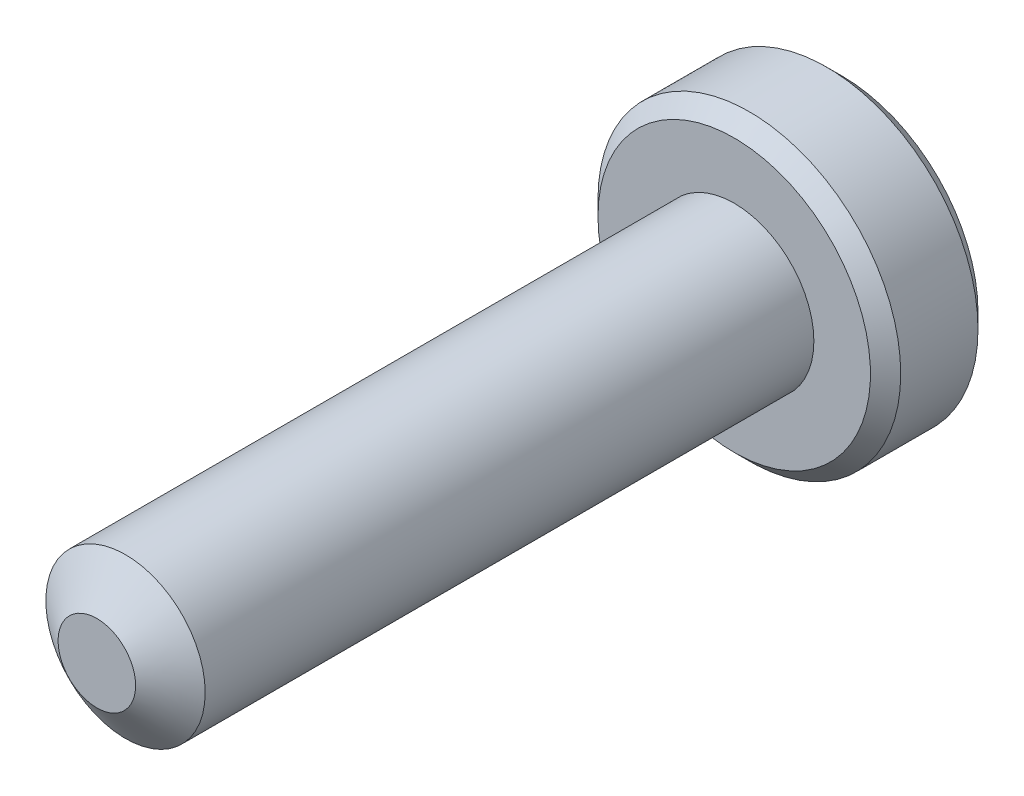
ISO-10303-21;
HEADER;
FILE_DESCRIPTION(('STEP AP214'),'2;1');
FILE_NAME('part.step','',(''),(''),'','','');
FILE_SCHEMA(('AUTOMOTIVE_DESIGN { 1 0 10303 214 1 1 1 1 }'));
ENDSEC;
DATA;
#1=APPLICATION_CONTEXT('core data for automotive mechanical design processes');
#2=APPLICATION_PROTOCOL_DEFINITION('international standard','automotive_design',2000,#1);
#3=PRODUCT_CONTEXT('',#1,'mechanical');
#4=PRODUCT('Part','Part','',(#3));
#5=PRODUCT_RELATED_PRODUCT_CATEGORY('part','',(#4));
#6=PRODUCT_DEFINITION_FORMATION('','',#4);
#7=PRODUCT_DEFINITION_CONTEXT('part definition',#1,'design');
#8=PRODUCT_DEFINITION('design','',#6,#7);
#9=PRODUCT_DEFINITION_SHAPE('','',#8);
#10=(LENGTH_UNIT() NAMED_UNIT(*) SI_UNIT(.MILLI.,.METRE.));
#11=(NAMED_UNIT(*) PLANE_ANGLE_UNIT() SI_UNIT($,.RADIAN.));
#12=(NAMED_UNIT(*) SI_UNIT($,.STERADIAN.) SOLID_ANGLE_UNIT());
#13=UNCERTAINTY_MEASURE_WITH_UNIT(LENGTH_MEASURE(1.E-05),#10,'distance_accuracy_value','');
#14=(GEOMETRIC_REPRESENTATION_CONTEXT(3) GLOBAL_UNCERTAINTY_ASSIGNED_CONTEXT((#13)) GLOBAL_UNIT_ASSIGNED_CONTEXT((#10,
#11,#12)) REPRESENTATION_CONTEXT('',''));
#15=CARTESIAN_POINT('',(0.,0.,0.));
#16=DIRECTION('',(0.,0.,1.));
#17=DIRECTION('',(1.,0.,0.));
#18=AXIS2_PLACEMENT_3D('',#15,#16,#17);
#19=CARTESIAN_POINT('',(0.,0.,-8.));
#20=DIRECTION('',(0.,0.,1.));
#21=DIRECTION('',(1.,0.,0.));
#22=AXIS2_PLACEMENT_3D('',#19,#20,#21);
#23=CYLINDRICAL_SURFACE('',#22,1.);
#24=CARTESIAN_POINT('',(0.,0.,-8.));
#25=DIRECTION('',(0.,0.,-1.));
#26=DIRECTION('',(-1.,0.,0.));
#27=AXIS2_PLACEMENT_3D('',#24,#25,#26);
#28=CIRCLE('',#27,1.);
#29=CARTESIAN_POINT('',(-1.,0.,-8.));
#30=VERTEX_POINT('',#29);
#31=EDGE_CURVE('E214',#30,#30,#28,.F.);
#32=ORIENTED_EDGE('',*,*,#31,.T.);
#33=EDGE_LOOP('',(#32));
#34=FACE_BOUND('',#33,.T.);
#35=CARTESIAN_POINT('',(0.,0.,-0.359771969508556));
#36=DIRECTION('',(0.,0.,1.));
#37=DIRECTION('',(1.,0.,0.));
#38=AXIS2_PLACEMENT_3D('',#35,#36,#37);
#39=CIRCLE('',#38,1.);
#40=CARTESIAN_POINT('',(1.,0.,-0.359771969508556));
#41=VERTEX_POINT('',#40);
#42=EDGE_CURVE('E108',#41,#41,#39,.T.);
#43=ORIENTED_EDGE('',*,*,#42,.F.);
#44=EDGE_LOOP('',(#43));
#45=FACE_BOUND('',#44,.T.);
#46=ADVANCED_FACE('F34',(#34,#45),#23,.T.);
#47=CARTESIAN_POINT('',(0.,0.,0.));
#48=DIRECTION('',(0.,0.,-1.));
#49=DIRECTION('',(-1.,0.,0.));
#50=AXIS2_PLACEMENT_3D('',#47,#48,#49);
#51=CONICAL_SURFACE('',#50,0.486192378864668,0.959931088596884);
#52=ORIENTED_EDGE('',*,*,#42,.T.);
#53=EDGE_LOOP('',(#52));
#54=FACE_BOUND('',#53,.T.);
#55=CARTESIAN_POINT('',(0.,0.,0.));
#56=DIRECTION('',(0.,0.,1.));
#57=DIRECTION('',(1.,0.,0.));
#58=AXIS2_PLACEMENT_3D('',#55,#56,#57);
#59=CIRCLE('',#58,0.486192378864668);
#60=CARTESIAN_POINT('',(0.486192378864668,0.,0.));
#61=VERTEX_POINT('',#60);
#62=EDGE_CURVE('E212',#61,#61,#59,.T.);
#63=ORIENTED_EDGE('',*,*,#62,.F.);
#64=EDGE_LOOP('',(#63));
#65=FACE_BOUND('',#64,.T.);
#66=ADVANCED_FACE('F195',(#54,#65),#51,.T.);
#67=CARTESIAN_POINT('',(0.,0.,0.));
#68=DIRECTION('',(0.,0.,1.));
#69=DIRECTION('',(1.,0.,0.));
#70=AXIS2_PLACEMENT_3D('',#67,#68,#69);
#71=PLANE('',#70);
#72=ORIENTED_EDGE('',*,*,#62,.T.);
#73=EDGE_LOOP('',(#72));
#74=FACE_BOUND('',#73,.T.);
#75=ADVANCED_FACE('F192',(#74),#71,.T.);
#76=CARTESIAN_POINT('',(0.,0.,-9.35));
#77=DIRECTION('',(0.,0.,1.));
#78=DIRECTION('',(1.,0.,0.));
#79=AXIS2_PLACEMENT_3D('',#76,#77,#78);
#80=CYLINDRICAL_SURFACE('',#79,1.9);
#81=CARTESIAN_POINT('',(0.,0.,-9.16000000000001));
#82=DIRECTION('',(0.,0.,-1.));
#83=DIRECTION('',(-1.,0.,0.));
#84=AXIS2_PLACEMENT_3D('',#81,#82,#83);
#85=CIRCLE('',#84,1.9);
#86=CARTESIAN_POINT('',(1.9,0.,-9.16));
#87=VERTEX_POINT('',#86);
#88=EDGE_CURVE('E42',#87,#87,#85,.F.);
#89=CARTESIAN_POINT('',(0.,0.,-8.19000000000001));
#90=DIRECTION('',(0.,0.,-1.));
#91=DIRECTION('',(-1.,0.,0.));
#92=AXIS2_PLACEMENT_3D('',#89,#90,#91);
#93=CIRCLE('',#92,1.9);
#94=CARTESIAN_POINT('',(1.9,0.,-8.19000000000001));
#95=VERTEX_POINT('',#94);
#96=EDGE_CURVE('E171',#95,#95,#93,.T.);
#97=CARTESIAN_POINT('',(1.9,0.,-9.16));
#98=CARTESIAN_POINT('',(1.9,0.,-9.14989583333334));
#99=CARTESIAN_POINT('',(1.9,0.,-9.13979166666667));
#100=CARTESIAN_POINT('',(1.9,0.,-9.11958333333334));
#101=CARTESIAN_POINT('',(1.9,0.,-9.10947916666667));
#102=CARTESIAN_POINT('',(1.9,0.,-9.08927083333334));
#103=CARTESIAN_POINT('',(1.9,0.,-9.07916666666667));
#104=CARTESIAN_POINT('',(1.9,0.,-9.05895833333334));
#105=CARTESIAN_POINT('',(1.9,0.,-9.04885416666667));
#106=CARTESIAN_POINT('',(1.9,0.,-9.02864583333334));
#107=CARTESIAN_POINT('',(1.9,0.,-9.01854166666667));
#108=CARTESIAN_POINT('',(1.9,0.,-8.99833333333334));
#109=CARTESIAN_POINT('',(1.9,0.,-8.98822916666667));
#110=CARTESIAN_POINT('',(1.9,0.,-8.96802083333334));
#111=CARTESIAN_POINT('',(1.9,0.,-8.95791666666667));
#112=CARTESIAN_POINT('',(1.9,0.,-8.93770833333334));
#113=CARTESIAN_POINT('',(1.9,0.,-8.92760416666667));
#114=CARTESIAN_POINT('',(1.9,0.,-8.90739583333334));
#115=CARTESIAN_POINT('',(1.9,0.,-8.89729166666667));
#116=CARTESIAN_POINT('',(1.9,0.,-8.87708333333334));
#117=CARTESIAN_POINT('',(1.9,0.,-8.86697916666667));
#118=CARTESIAN_POINT('',(1.9,0.,-8.84677083333334));
#119=CARTESIAN_POINT('',(1.9,0.,-8.83666666666667));
#120=CARTESIAN_POINT('',(1.9,0.,-8.81645833333334));
#121=CARTESIAN_POINT('',(1.9,0.,-8.80635416666667));
#122=CARTESIAN_POINT('',(1.9,0.,-8.78614583333334));
#123=CARTESIAN_POINT('',(1.9,0.,-8.77604166666667));
#124=CARTESIAN_POINT('',(1.9,0.,-8.75583333333334));
#125=CARTESIAN_POINT('',(1.9,0.,-8.74572916666667));
#126=CARTESIAN_POINT('',(1.9,0.,-8.72552083333334));
#127=CARTESIAN_POINT('',(1.9,0.,-8.71541666666667));
#128=CARTESIAN_POINT('',(1.9,0.,-8.69520833333334));
#129=CARTESIAN_POINT('',(1.9,0.,-8.68510416666667));
#130=CARTESIAN_POINT('',(1.9,0.,-8.66489583333334));
#131=CARTESIAN_POINT('',(1.9,0.,-8.65479166666667));
#132=CARTESIAN_POINT('',(1.9,0.,-8.63458333333334));
#133=CARTESIAN_POINT('',(1.9,0.,-8.62447916666667));
#134=CARTESIAN_POINT('',(1.9,0.,-8.60427083333334));
#135=CARTESIAN_POINT('',(1.9,0.,-8.59416666666667));
#136=CARTESIAN_POINT('',(1.9,0.,-8.57395833333334));
#137=CARTESIAN_POINT('',(1.9,0.,-8.56385416666667));
#138=CARTESIAN_POINT('',(1.9,0.,-8.54364583333334));
#139=CARTESIAN_POINT('',(1.9,0.,-8.53354166666667));
#140=CARTESIAN_POINT('',(1.9,0.,-8.51333333333334));
#141=CARTESIAN_POINT('',(1.9,0.,-8.50322916666667));
#142=CARTESIAN_POINT('',(1.9,0.,-8.48302083333334));
#143=CARTESIAN_POINT('',(1.9,0.,-8.47291666666667));
#144=CARTESIAN_POINT('',(1.9,0.,-8.45270833333334));
#145=CARTESIAN_POINT('',(1.9,0.,-8.44260416666667));
#146=CARTESIAN_POINT('',(1.9,0.,-8.42239583333334));
#147=CARTESIAN_POINT('',(1.9,0.,-8.41229166666667));
#148=CARTESIAN_POINT('',(1.9,0.,-8.39208333333334));
#149=CARTESIAN_POINT('',(1.9,0.,-8.38197916666667));
#150=CARTESIAN_POINT('',(1.9,0.,-8.36177083333334));
#151=CARTESIAN_POINT('',(1.9,0.,-8.35166666666668));
#152=CARTESIAN_POINT('',(1.9,0.,-8.33145833333334));
#153=CARTESIAN_POINT('',(1.9,0.,-8.32135416666667));
#154=CARTESIAN_POINT('',(1.9,0.,-8.30114583333334));
#155=CARTESIAN_POINT('',(1.9,0.,-8.29104166666668));
#156=CARTESIAN_POINT('',(1.9,0.,-8.27083333333334));
#157=CARTESIAN_POINT('',(1.9,0.,-8.26072916666667));
#158=CARTESIAN_POINT('',(1.9,0.,-8.24052083333334));
#159=CARTESIAN_POINT('',(1.9,0.,-8.23041666666668));
#160=CARTESIAN_POINT('',(1.9,0.,-8.21020833333334));
#161=CARTESIAN_POINT('',(1.9,0.,-8.20010416666667));
#162=CARTESIAN_POINT('',(1.9,0.,-8.19000000000001));
#163=B_SPLINE_CURVE_WITH_KNOTS('',3,(#97,#98,#99,#100,#101,#102,#103,#104,#105,#106,#107,#108,
#109,#110,#111,#112,#113,#114,#115,#116,#117,#118,#119,#120,#121,#122,#123,#124,#125,#126,#127,
#128,#129,#130,#131,#132,#133,#134,#135,#136,#137,#138,#139,#140,#141,#142,#143,#144,#145,#146,
#147,#148,#149,#150,#151,#152,#153,#154,#155,#156,#157,#158,#159,#160,#161,#162),.UNSPECIFIED.,
.F.,.F.,(4,2,2,2,2,2,2,2,2,2,2,2,2,2,2,2,2,2,2,2,2,2,2,2,2,2,2,2,2,2,2,2,4),(0.,
0.0303124999999991,0.0606249999999982,0.090937499999999,0.121249999999998,0.151562499999999,
0.181874999999998,0.212187499999999,0.242499999999998,0.272812499999999,0.303124999999998,
0.333437499999997,0.363749999999998,0.394062499999997,0.424374999999998,0.454687499999997,
0.484999999999998,0.515312499999997,0.545624999999996,0.575937499999997,0.606249999999996,
0.636562499999996,0.666874999999996,0.697187499999996,0.727499999999995,0.757812499999996,
0.788124999999995,0.818437499999994,0.848749999999995,0.879062499999994,0.909374999999995,
0.939687499999994,0.969999999999995),.UNSPECIFIED.);
#164=EDGE_CURVE('BSEAM176',#87,#95,#163,.T.);
#165=ORIENTED_EDGE('',*,*,#88,.T.);
#166=ORIENTED_EDGE('',*,*,#96,.T.);
#167=ORIENTED_EDGE('',*,*,#164,.T.);
#168=ORIENTED_EDGE('',*,*,#164,.F.);
#169=EDGE_LOOP('',(#165,#167,#166,#168));
#170=FACE_BOUND('',#169,.T.);
#171=ADVANCED_FACE('F176',(#170),#80,.T.);
#172=CARTESIAN_POINT('',(0.,0.,-9.35));
#173=DIRECTION('',(0.,0.,-1.));
#174=DIRECTION('',(-1.,0.,0.));
#175=AXIS2_PLACEMENT_3D('',#172,#173,#174);
#176=PLANE('',#175);
#177=CARTESIAN_POINT('',(0.,0.,-9.35));
#178=DIRECTION('',(0.,0.,-1.));
#179=DIRECTION('',(-1.,0.,0.));
#180=AXIS2_PLACEMENT_3D('',#177,#178,#179);
#181=CIRCLE('',#180,1.71);
#182=CARTESIAN_POINT('',(-1.71,0.,-9.35));
#183=VERTEX_POINT('',#182);
#184=EDGE_CURVE('E107',#183,#183,#181,.T.);
#185=ORIENTED_EDGE('',*,*,#184,.T.);
#186=EDGE_LOOP('',(#185));
#187=FACE_BOUND('',#186,.T.);
#188=CARTESIAN_POINT('',(0.,0.,-9.35));
#189=DIRECTION('',(0.,0.,-1.));
#190=DIRECTION('',(-1.,0.,0.));
#191=AXIS2_PLACEMENT_3D('',#188,#189,#190);
#192=CIRCLE('',#191,0.750555349946514);
#193=CARTESIAN_POINT('',(-0.649999999999997,0.375277674973262,-9.35));
#194=VERTEX_POINT('',#193);
#195=CARTESIAN_POINT('',(0.,0.750555349946514,-9.35));
#196=VERTEX_POINT('',#195);
#197=EDGE_CURVE('E88',#194,#196,#192,.T.);
#198=ORIENTED_EDGE('',*,*,#197,.F.);
#199=CARTESIAN_POINT('',(-0.649999999999998,-0.375277674973257,-9.35));
#200=VERTEX_POINT('',#199);
#201=EDGE_CURVE('E48',#200,#194,#192,.T.);
#202=ORIENTED_EDGE('',*,*,#201,.F.);
#203=CARTESIAN_POINT('',(0.,-0.750555349946514,-9.35));
#204=VERTEX_POINT('',#203);
#205=EDGE_CURVE('E273',#204,#200,#192,.T.);
#206=ORIENTED_EDGE('',*,*,#205,.F.);
#207=CARTESIAN_POINT('',(0.649999999999999,-0.375277674973259,-9.35));
#208=VERTEX_POINT('',#207);
#209=EDGE_CURVE('E55',#208,#204,#192,.T.);
#210=ORIENTED_EDGE('',*,*,#209,.F.);
#211=CARTESIAN_POINT('',(0.65,0.375277674973257,-9.35));
#212=VERTEX_POINT('',#211);
#213=EDGE_CURVE('E129',#212,#208,#192,.T.);
#214=ORIENTED_EDGE('',*,*,#213,.F.);
#215=EDGE_CURVE('E97',#196,#212,#192,.T.);
#216=ORIENTED_EDGE('',*,*,#215,.F.);
#217=EDGE_LOOP('',(#198,#202,#206,#210,#214,#216));
#218=FACE_BOUND('',#217,.T.);
#219=ADVANCED_FACE('F128',(#187,#218),#176,.T.);
#220=CARTESIAN_POINT('',(0.,0.,-8.));
#221=DIRECTION('',(0.,0.,-1.));
#222=DIRECTION('',(-1.,0.,0.));
#223=AXIS2_PLACEMENT_3D('',#220,#221,#222);
#224=PLANE('',#223);
#225=CARTESIAN_POINT('',(0.,0.,-8.));
#226=DIRECTION('',(0.,0.,-1.));
#227=DIRECTION('',(-1.,0.,0.));
#228=AXIS2_PLACEMENT_3D('',#225,#226,#227);
#229=CIRCLE('',#228,1.70999999999999);
#230=CARTESIAN_POINT('',(-1.70999999999999,0.,-8.));
#231=VERTEX_POINT('',#230);
#232=EDGE_CURVE('E11',#231,#231,#229,.F.);
#233=ORIENTED_EDGE('',*,*,#232,.T.);
#234=EDGE_LOOP('',(#233));
#235=FACE_BOUND('',#234,.T.);
#236=ORIENTED_EDGE('',*,*,#31,.F.);
#237=EDGE_LOOP('',(#236));
#238=FACE_BOUND('',#237,.T.);
#239=ADVANCED_FACE('F185',(#235,#238),#224,.F.);
#240=CARTESIAN_POINT('',(0.,0.,-9.35));
#241=DIRECTION('',(0.,0.,-1.));
#242=DIRECTION('',(-1.,0.,0.));
#243=AXIS2_PLACEMENT_3D('',#240,#241,#242);
#244=CONICAL_SURFACE('',#243,0.750555349946514,0.78539816339745);
#245=ORIENTED_EDGE('',*,*,#215,.T.);
#246=CARTESIAN_POINT('',(-0.000199999999999112,0.750670820000351,-9.35011549669667));
#247=CARTESIAN_POINT('',(0.022153875442622,0.737764803996123,-9.33721736219155));
#248=CARTESIAN_POINT('',(0.044880120532614,0.724643800275746,-9.32507515489864));
#249=CARTESIAN_POINT('',(0.0912219846432838,0.697888312556702,-9.30284224486223));
#250=CARTESIAN_POINT('',(0.114842019040598,0.684251279339145,-9.29276392481001));
#251=CARTESIAN_POINT('',(0.162473808706857,0.656751052753346,-9.27550151642338));
#252=CARTESIAN_POINT('',(0.186473364593087,0.642894902702,-9.26827395851558));
#253=CARTESIAN_POINT('',(0.23498941024521,0.61488415068473,-9.25712920200001));
#254=CARTESIAN_POINT('',(0.259504444041882,0.600730389323029,-9.25320370262187));
#255=CARTESIAN_POINT('',(0.319384402335921,0.566158679282903,-9.24822343733471));
#256=CARTESIAN_POINT('',(0.354889192903236,0.545659978891342,-9.24912448479266));
#257=CARTESIAN_POINT('',(0.425154552317995,0.505092254718525,-9.25840856131667));
#258=CARTESIAN_POINT('',(0.459913930439302,0.485023918403324,-9.26680276302966));
#259=CARTESIAN_POINT('',(0.52095826250894,0.449779956850418,-9.2870456785073));
#260=CARTESIAN_POINT('',(0.547523861415085,0.434442301170771,-9.2978384232645));
#261=CARTESIAN_POINT('',(0.599614154899066,0.404367956205628,-9.3221519314496));
#262=CARTESIAN_POINT('',(0.625141918825035,0.389629494831161,-9.33566382100729));
#263=CARTESIAN_POINT('',(0.650199999999998,0.37516220491942,-9.35011549669667));
#264=B_SPLINE_CURVE_WITH_KNOTS('',3,(#246,#247,#248,#249,#250,#251,#252,#253,#254,#255,#256,
#257,#258,#259,#260,#261,#262,#263),.UNSPECIFIED.,.F.,.F.,(4,2,2,2,2,2,2,2,4),(0.,
0.0866236559063447,0.173752711623243,0.259496442803568,0.345023980281752,0.467267720550125,
0.589694037029336,0.68711130875548,0.784215671813663),.UNSPECIFIED.);
#265=EDGE_CURVE('E102',#196,#212,#264,.T.);
#266=ORIENTED_EDGE('',*,*,#265,.F.);
#267=EDGE_LOOP('',(#245,#266));
#268=FACE_BOUND('',#267,.T.);
#269=ADVANCED_FACE('F103',(#268),#244,.F.);
#270=ORIENTED_EDGE('',*,*,#213,.T.);
#271=CARTESIAN_POINT('',(0.649999999999999,-0.748456856202,-9.59075069038401));
#272=CARTESIAN_POINT('',(0.649999999999999,-0.711991073878822,-9.56328028593362));
#273=CARTESIAN_POINT('',(0.649999999999999,-0.6751396400828,-9.5362651954762));
#274=CARTESIAN_POINT('',(0.649999999999999,-0.600031183452824,-9.48362934828316));
#275=CARTESIAN_POINT('',(0.649999999999999,-0.561765441270899,-9.4580211061291));
#276=CARTESIAN_POINT('',(0.649999999999999,-0.481525479406324,-9.40773749376246));
#277=CARTESIAN_POINT('',(0.649999999999999,-0.439464253670489,-9.38319880219876));
#278=CARTESIAN_POINT('',(0.649999999999999,-0.353242719412721,-9.33831465969863));
#279=CARTESIAN_POINT('',(0.649999999999999,-0.309090130602526,-9.31795507248949));
#280=CARTESIAN_POINT('',(0.649999999999999,-0.242810057498669,-9.29304872908865));
#281=CARTESIAN_POINT('',(0.649999999999999,-0.221667349821689,-9.28590072741471));
#282=CARTESIAN_POINT('',(0.649999999999999,-0.178882845085543,-9.27329752945254));
#283=CARTESIAN_POINT('',(0.649999999999999,-0.157241013753964,-9.26784244978312));
#284=CARTESIAN_POINT('',(0.649999999999999,-0.0924732258239351,-9.25466076531022));
#285=CARTESIAN_POINT('',(0.649999999999999,-0.0486986201802785,-9.24979355976944));
#286=CARTESIAN_POINT('',(0.649999999999999,0.0373331587621227,-9.24914448923078));
#287=CARTESIAN_POINT('',(0.649999999999999,0.0795879418799255,-9.2530403393198));
#288=CARTESIAN_POINT('',(0.649999999999999,0.142230570834974,-9.26449232559783));
#289=CARTESIAN_POINT('',(0.649999999999999,0.163174856664668,-9.26931456423673));
#290=CARTESIAN_POINT('',(0.649999999999999,0.204615212735413,-9.28060009995474));
#291=CARTESIAN_POINT('',(0.649999999999999,0.225111320324616,-9.28706325972014));
#292=CARTESIAN_POINT('',(0.649999999999999,0.28963853477237,-9.30984409213164));
#293=CARTESIAN_POINT('',(0.649999999999999,0.33274820687505,-9.3287572451342));
#294=CARTESIAN_POINT('',(0.649999999999999,0.416943840013233,-9.37081128188878));
#295=CARTESIAN_POINT('',(0.649999999999999,0.458021834530769,-9.39396735475778));
#296=CARTESIAN_POINT('',(0.649999999999999,0.536529233245989,-9.44172663971809));
#297=CARTESIAN_POINT('',(0.649999999999999,0.574038509134621,-9.46620075812715));
#298=CARTESIAN_POINT('',(0.649999999999999,0.647609691485456,-9.51662345601488));
#299=CARTESIAN_POINT('',(0.649999999999999,0.683680924535918,-9.54255834365529));
#300=CARTESIAN_POINT('',(0.649999999999999,0.71935620475114,-9.56896687739743));
#301=B_SPLINE_CURVE_WITH_KNOTS('',3,(#271,#272,#273,#274,#275,#276,#277,#278,#279,#280,#281,
#282,#283,#284,#285,#286,#287,#288,#289,#290,#291,#292,#293,#294,#295,#296,#297,#298,#299,#300),
.UNSPECIFIED.,.F.,.F.,(4,2,2,2,2,2,2,2,2,2,2,2,2,2,4),(0.,0.137014030009581,0.275096405762554,
0.421060359835526,0.566522128775096,0.633415056462923,0.700312591121807,0.831534924508341,
0.958010408789903,1.02242898521266,1.08684217280829,1.22766018796413,1.36899252873704,
1.50330165960873,1.63651263433843),.UNSPECIFIED.);
#302=EDGE_CURVE('E96',#212,#208,#301,.F.);
#303=ORIENTED_EDGE('',*,*,#302,.F.);
#304=EDGE_LOOP('',(#270,#303));
#305=FACE_BOUND('',#304,.T.);
#306=ADVANCED_FACE('F279',(#305),#244,.F.);
#307=ORIENTED_EDGE('',*,*,#209,.T.);
#308=CARTESIAN_POINT('',(0.650199999999998,-0.375162204919418,-9.35011549669667));
#309=CARTESIAN_POINT('',(0.627846124557378,-0.388068220923646,-9.33721736219155));
#310=CARTESIAN_POINT('',(0.605119879467386,-0.401189224644023,-9.32507515489864));
#311=CARTESIAN_POINT('',(0.558778015356716,-0.427944712363067,-9.30284224486223));
#312=CARTESIAN_POINT('',(0.535157980959403,-0.441581745580624,-9.29276392481001));
#313=CARTESIAN_POINT('',(0.487526191293143,-0.469081972166423,-9.27550151642338));
#314=CARTESIAN_POINT('',(0.463526635406914,-0.482938122217769,-9.26827395851558));
#315=CARTESIAN_POINT('',(0.41501058975479,-0.510948874235039,-9.25712920200001));
#316=CARTESIAN_POINT('',(0.390495555958119,-0.52510263559674,-9.25320370262187));
#317=CARTESIAN_POINT('',(0.330615597664079,-0.559674345636867,-9.24822343733471));
#318=CARTESIAN_POINT('',(0.295110807096764,-0.580173046028428,-9.24912448479266));
#319=CARTESIAN_POINT('',(0.224845447682005,-0.620740770201245,-9.25840856131667));
#320=CARTESIAN_POINT('',(0.190086069560698,-0.640809106516445,-9.26680276302966));
#321=CARTESIAN_POINT('',(0.12904173749106,-0.676053068069352,-9.2870456785073));
#322=CARTESIAN_POINT('',(0.102476138584914,-0.691390723748998,-9.2978384232645));
#323=CARTESIAN_POINT('',(0.0503858451009331,-0.721465068714142,-9.3221519314496));
#324=CARTESIAN_POINT('',(0.0248580811749641,-0.736203530088609,-9.33566382100729));
#325=CARTESIAN_POINT('',(-0.000200000000000466,-0.750670820000351,-9.35011549669667));
#326=B_SPLINE_CURVE_WITH_KNOTS('',3,(#308,#309,#310,#311,#312,#313,#314,#315,#316,#317,#318,
#319,#320,#321,#322,#323,#324,#325),.UNSPECIFIED.,.F.,.F.,(4,2,2,2,2,2,2,2,4),(0.,
0.0866236559063438,0.173752711623241,0.259496442803567,0.345023980281751,0.467267720550124,
0.589694037029334,0.687111308755479,0.784215671813664),.UNSPECIFIED.);
#327=EDGE_CURVE('E139',#208,#204,#326,.T.);
#328=ORIENTED_EDGE('',*,*,#327,.F.);
#329=EDGE_LOOP('',(#307,#328));
#330=FACE_BOUND('',#329,.T.);
#331=ADVANCED_FACE('F276',(#330),#244,.F.);
#332=ORIENTED_EDGE('',*,*,#205,.T.);
#333=CARTESIAN_POINT('',(0.00020000000000038,-0.75067082000035,-9.35011549669667));
#334=CARTESIAN_POINT('',(-0.0221538754426201,-0.737764803996122,-9.33721736219155));
#335=CARTESIAN_POINT('',(-0.044880120532612,-0.724643800275746,-9.32507515489864));
#336=CARTESIAN_POINT('',(-0.0912219846432821,-0.697888312556701,-9.30284224486222));
#337=CARTESIAN_POINT('',(-0.114842019040596,-0.684251279339144,-9.29276392481001));
#338=CARTESIAN_POINT('',(-0.162473808706856,-0.656751052753345,-9.27550151642337));
#339=CARTESIAN_POINT('',(-0.186473364593086,-0.642894902701999,-9.26827395851558));
#340=CARTESIAN_POINT('',(-0.23498941024521,-0.614884150684729,-9.25712920200001));
#341=CARTESIAN_POINT('',(-0.259504444041881,-0.600730389323028,-9.25320370262187));
#342=CARTESIAN_POINT('',(-0.319384402335921,-0.566158679282901,-9.24822343733471));
#343=CARTESIAN_POINT('',(-0.354889192903236,-0.54565997889134,-9.24912448479266));
#344=CARTESIAN_POINT('',(-0.425154552317995,-0.505092254718523,-9.25840856131667));
#345=CARTESIAN_POINT('',(-0.459913930439302,-0.485023918403322,-9.26680276302966));
#346=CARTESIAN_POINT('',(-0.52095826250894,-0.449779956850416,-9.2870456785073));
#347=CARTESIAN_POINT('',(-0.547523861415085,-0.43444230117077,-9.2978384232645));
#348=CARTESIAN_POINT('',(-0.599614154899066,-0.404367956205627,-9.3221519314496));
#349=CARTESIAN_POINT('',(-0.625141918825034,-0.38962949483116,-9.33566382100729));
#350=CARTESIAN_POINT('',(-0.650199999999998,-0.375162204919419,-9.35011549669667));
#351=B_SPLINE_CURVE_WITH_KNOTS('',3,(#333,#334,#335,#336,#337,#338,#339,#340,#341,#342,#343,
#344,#345,#346,#347,#348,#349,#350),.UNSPECIFIED.,.F.,.F.,(4,2,2,2,2,2,2,2,4),(0.,
0.0866236559063447,0.173752711623244,0.25949644280357,0.345023980281754,0.467267720550127,
0.589694037029337,0.687111308755481,0.784215671813663),.UNSPECIFIED.);
#352=EDGE_CURVE('E250',#204,#200,#351,.T.);
#353=ORIENTED_EDGE('',*,*,#352,.F.);
#354=EDGE_LOOP('',(#332,#353));
#355=FACE_BOUND('',#354,.T.);
#356=ADVANCED_FACE('F275',(#355),#244,.F.);
#357=ORIENTED_EDGE('',*,*,#201,.T.);
#358=CARTESIAN_POINT('',(-0.649999999999998,-0.748456856202003,-9.59075069038401));
#359=CARTESIAN_POINT('',(-0.649999999999998,-0.711991073878825,-9.56328028593363));
#360=CARTESIAN_POINT('',(-0.649999999999998,-0.675139640082803,-9.5362651954762));
#361=CARTESIAN_POINT('',(-0.649999999999998,-0.600031183452827,-9.48362934828317));
#362=CARTESIAN_POINT('',(-0.649999999999998,-0.561765441270902,-9.4580211061291));
#363=CARTESIAN_POINT('',(-0.649999999999998,-0.481525479406327,-9.40773749376246));
#364=CARTESIAN_POINT('',(-0.649999999999998,-0.439464253670491,-9.38319880219876));
#365=CARTESIAN_POINT('',(-0.649999999999998,-0.353242719412723,-9.33831465969863));
#366=CARTESIAN_POINT('',(-0.649999999999998,-0.309090130602528,-9.31795507248949));
#367=CARTESIAN_POINT('',(-0.649999999999998,-0.242810057498671,-9.29304872908865));
#368=CARTESIAN_POINT('',(-0.649999999999998,-0.221667349821691,-9.28590072741471));
#369=CARTESIAN_POINT('',(-0.649999999999998,-0.178882845085545,-9.27329752945254));
#370=CARTESIAN_POINT('',(-0.649999999999998,-0.157241013753966,-9.26784244978312));
#371=CARTESIAN_POINT('',(-0.649999999999998,-0.0924732258239363,-9.25466076531022));
#372=CARTESIAN_POINT('',(-0.649999999999998,-0.0486986201802794,-9.24979355976944));
#373=CARTESIAN_POINT('',(-0.649999999999998,0.0373331587621221,-9.24914448923078));
#374=CARTESIAN_POINT('',(-0.649999999999997,0.079587941879925,-9.2530403393198));
#375=CARTESIAN_POINT('',(-0.649999999999997,0.142230570834973,-9.26449232559783));
#376=CARTESIAN_POINT('',(-0.649999999999997,0.163174856664667,-9.26931456423673));
#377=CARTESIAN_POINT('',(-0.649999999999997,0.204615212735412,-9.28060009995474));
#378=CARTESIAN_POINT('',(-0.649999999999997,0.225111320324615,-9.28706325972014));
#379=CARTESIAN_POINT('',(-0.649999999999997,0.289638534772369,-9.30984409213164));
#380=CARTESIAN_POINT('',(-0.649999999999997,0.332748206875049,-9.3287572451342));
#381=CARTESIAN_POINT('',(-0.649999999999997,0.416943840013232,-9.37081128188878));
#382=CARTESIAN_POINT('',(-0.649999999999997,0.458021834530767,-9.39396735475777));
#383=CARTESIAN_POINT('',(-0.649999999999997,0.536529233245987,-9.44172663971809));
#384=CARTESIAN_POINT('',(-0.649999999999997,0.574038509134619,-9.46620075812715));
#385=CARTESIAN_POINT('',(-0.649999999999997,0.647609691485453,-9.51662345601488));
#386=CARTESIAN_POINT('',(-0.649999999999997,0.683680924535915,-9.54255834365529));
#387=CARTESIAN_POINT('',(-0.649999999999997,0.719356204751136,-9.56896687739743));
#388=B_SPLINE_CURVE_WITH_KNOTS('',3,(#358,#359,#360,#361,#362,#363,#364,#365,#366,#367,#368,
#369,#370,#371,#372,#373,#374,#375,#376,#377,#378,#379,#380,#381,#382,#383,#384,#385,#386,#387),
.UNSPECIFIED.,.F.,.F.,(4,2,2,2,2,2,2,2,2,2,2,2,2,2,4),(0.,0.13701403000958,0.275096405762554,
0.421060359835528,0.566522128775098,0.633415056462925,0.700312591121809,0.831534924508344,
0.958010408789907,1.02242898521266,1.08684217280829,1.22766018796413,1.36899252873704,
1.50330165960874,1.63651263433843),.UNSPECIFIED.);
#389=EDGE_CURVE('E118',#200,#194,#388,.T.);
#390=ORIENTED_EDGE('',*,*,#389,.F.);
#391=EDGE_LOOP('',(#357,#390));
#392=FACE_BOUND('',#391,.T.);
#393=ADVANCED_FACE('F288',(#392),#244,.F.);
#394=ORIENTED_EDGE('',*,*,#197,.T.);
#395=CARTESIAN_POINT('',(-0.650199999999997,0.37516220491942,-9.35011549669667));
#396=CARTESIAN_POINT('',(-0.627846124557377,0.388068220923649,-9.33721736219155));
#397=CARTESIAN_POINT('',(-0.605119879467385,0.401189224644025,-9.32507515489864));
#398=CARTESIAN_POINT('',(-0.558778015356715,0.427944712363069,-9.30284224486223));
#399=CARTESIAN_POINT('',(-0.535157980959401,0.441581745580627,-9.29276392481001));
#400=CARTESIAN_POINT('',(-0.487526191293142,0.469081972166425,-9.27550151642338));
#401=CARTESIAN_POINT('',(-0.463526635406912,0.482938122217771,-9.26827395851558));
#402=CARTESIAN_POINT('',(-0.415010589754789,0.510948874235041,-9.25712920200001));
#403=CARTESIAN_POINT('',(-0.390495555958118,0.525102635596742,-9.25320370262187));
#404=CARTESIAN_POINT('',(-0.330615597664079,0.559674345636868,-9.24822343733471));
#405=CARTESIAN_POINT('',(-0.295110807096764,0.580173046028429,-9.24912448479266));
#406=CARTESIAN_POINT('',(-0.224845447682005,0.620740770201246,-9.25840856131667));
#407=CARTESIAN_POINT('',(-0.190086069560698,0.640809106516446,-9.26680276302966));
#408=CARTESIAN_POINT('',(-0.12904173749106,0.676053068069353,-9.2870456785073));
#409=CARTESIAN_POINT('',(-0.102476138584914,0.691390723749,-9.2978384232645));
#410=CARTESIAN_POINT('',(-0.0503858451009323,0.721465068714143,-9.3221519314496));
#411=CARTESIAN_POINT('',(-0.0248580811749635,0.736203530088611,-9.33566382100729));
#412=CARTESIAN_POINT('',(0.00020000000000054,0.750670820000351,-9.35011549669667));
#413=B_SPLINE_CURVE_WITH_KNOTS('',3,(#395,#396,#397,#398,#399,#400,#401,#402,#403,#404,#405,
#406,#407,#408,#409,#410,#411,#412),.UNSPECIFIED.,.F.,.F.,(4,2,2,2,2,2,2,2,4),(0.,
0.0866236559063441,0.173752711623241,0.259496442803567,0.34502398028175,0.467267720550123,
0.589694037029333,0.687111308755478,0.784215671813663),.UNSPECIFIED.);
#414=EDGE_CURVE('E92',#194,#196,#413,.T.);
#415=ORIENTED_EDGE('',*,*,#414,.F.);
#416=EDGE_LOOP('',(#394,#415));
#417=FACE_BOUND('',#416,.T.);
#418=ADVANCED_FACE('F90',(#417),#244,.F.);
#419=CARTESIAN_POINT('',(0.649999999999999,1.12583302491977,-8.375));
#420=DIRECTION('',(0.,0.,-1.));
#421=DIRECTION('',(-1.,0.,0.));
#422=AXIS2_PLACEMENT_3D('',#419,#420,#421);
#423=PLANE('',#422);
#424=DIRECTION('',(0.866025403784439,0.5,0.));
#425=VECTOR('',#424,1.);
#426=CARTESIAN_POINT('',(-0.649999999999997,0.375277674973258,-8.375));
#427=LINE('',#426,#425);
#428=CARTESIAN_POINT('',(-0.649999999999997,0.375277674973258,-8.375));
#429=VERTEX_POINT('',#428);
#430=CARTESIAN_POINT('',(0.,0.750555349946514,-8.375));
#431=VERTEX_POINT('',#430);
#432=EDGE_CURVE('E117',#429,#431,#427,.T.);
#433=ORIENTED_EDGE('',*,*,#432,.T.);
#434=DIRECTION('',(0.866025403784439,-0.5,0.));
#435=VECTOR('',#434,1.);
#436=CARTESIAN_POINT('',(0.,0.750555349946514,-8.375));
#437=LINE('',#436,#435);
#438=CARTESIAN_POINT('',(0.649999999999999,0.375277674973258,-8.375));
#439=VERTEX_POINT('',#438);
#440=EDGE_CURVE('E122',#431,#439,#437,.T.);
#441=ORIENTED_EDGE('',*,*,#440,.T.);
#442=DIRECTION('',(0.,-1.,0.));
#443=VECTOR('',#442,1.);
#444=CARTESIAN_POINT('',(0.649999999999999,0.375277674973258,-8.375));
#445=LINE('',#444,#443);
#446=CARTESIAN_POINT('',(0.649999999999999,-0.375277674973256,-8.375));
#447=VERTEX_POINT('',#446);
#448=EDGE_CURVE('E236',#439,#447,#445,.T.);
#449=ORIENTED_EDGE('',*,*,#448,.T.);
#450=DIRECTION('',(-0.866025403784438,-0.5,0.));
#451=VECTOR('',#450,1.);
#452=CARTESIAN_POINT('',(0.649999999999999,-0.375277674973256,-8.375));
#453=LINE('',#452,#451);
#454=CARTESIAN_POINT('',(0.,-0.750555349946512,-8.375));
#455=VERTEX_POINT('',#454);
#456=EDGE_CURVE('E233',#447,#455,#453,.T.);
#457=ORIENTED_EDGE('',*,*,#456,.T.);
#458=DIRECTION('',(-0.866025403784439,0.5,0.));
#459=VECTOR('',#458,1.);
#460=CARTESIAN_POINT('',(0.,-0.750555349946512,-8.375));
#461=LINE('',#460,#459);
#462=CARTESIAN_POINT('',(-0.649999999999998,-0.375277674973257,-8.375));
#463=VERTEX_POINT('',#462);
#464=EDGE_CURVE('E230',#455,#463,#461,.T.);
#465=ORIENTED_EDGE('',*,*,#464,.T.);
#466=DIRECTION('',(0.,1.,0.));
#467=VECTOR('',#466,1.);
#468=CARTESIAN_POINT('',(-0.649999999999998,-0.375277674973257,-8.375));
#469=LINE('',#468,#467);
#470=EDGE_CURVE('E125',#463,#429,#469,.T.);
#471=ORIENTED_EDGE('',*,*,#470,.T.);
#472=EDGE_LOOP('',(#433,#441,#449,#457,#465,#471));
#473=FACE_BOUND('',#472,.T.);
#474=ADVANCED_FACE('F159',(#473),#423,.T.);
#475=CARTESIAN_POINT('',(0.,0.750555349946514,-8.375));
#476=DIRECTION('',(0.5,0.866025403784439,0.));
#477=DIRECTION('',(-0.866025403784439,0.5,0.));
#478=AXIS2_PLACEMENT_3D('',#475,#476,#477);
#479=PLANE('',#478);
#480=DIRECTION('',(0.,0.,-1.));
#481=VECTOR('',#480,1.);
#482=CARTESIAN_POINT('',(0.,0.750555349946514,-8.375));
#483=LINE('',#482,#481);
#484=EDGE_CURVE('E114',#431,#196,#483,.T.);
#485=ORIENTED_EDGE('',*,*,#484,.T.);
#486=ORIENTED_EDGE('',*,*,#265,.T.);
#487=DIRECTION('',(0.,0.,-1.));
#488=VECTOR('',#487,1.);
#489=CARTESIAN_POINT('',(0.649999999999999,0.375277674973258,-8.375));
#490=LINE('',#489,#488);
#491=EDGE_CURVE('E124',#439,#212,#490,.T.);
#492=ORIENTED_EDGE('',*,*,#491,.F.);
#493=ORIENTED_EDGE('',*,*,#440,.F.);
#494=EDGE_LOOP('',(#485,#486,#492,#493));
#495=FACE_BOUND('',#494,.T.);
#496=ADVANCED_FACE('F120',(#495),#479,.F.);
#497=CARTESIAN_POINT('',(0.649999999999999,0.375277674973258,-8.375));
#498=DIRECTION('',(1.,0.,0.));
#499=DIRECTION('',(0.,0.,-1.));
#500=AXIS2_PLACEMENT_3D('',#497,#498,#499);
#501=PLANE('',#500);
#502=ORIENTED_EDGE('',*,*,#491,.T.);
#503=ORIENTED_EDGE('',*,*,#302,.T.);
#504=DIRECTION('',(0.,0.,-1.));
#505=VECTOR('',#504,1.);
#506=CARTESIAN_POINT('',(0.649999999999999,-0.375277674973256,-8.375));
#507=LINE('',#506,#505);
#508=EDGE_CURVE('E219',#447,#208,#507,.T.);
#509=ORIENTED_EDGE('',*,*,#508,.F.);
#510=ORIENTED_EDGE('',*,*,#448,.F.);
#511=EDGE_LOOP('',(#502,#503,#509,#510));
#512=FACE_BOUND('',#511,.T.);
#513=ADVANCED_FACE('F148',(#512),#501,.F.);
#514=CARTESIAN_POINT('',(0.649999999999999,-0.375277674973256,-8.375));
#515=DIRECTION('',(0.5,-0.866025403784438,0.));
#516=DIRECTION('',(0.866025403784438,0.5,0.));
#517=AXIS2_PLACEMENT_3D('',#514,#515,#516);
#518=PLANE('',#517);
#519=ORIENTED_EDGE('',*,*,#508,.T.);
#520=ORIENTED_EDGE('',*,*,#327,.T.);
#521=DIRECTION('',(0.,0.,-1.));
#522=VECTOR('',#521,1.);
#523=CARTESIAN_POINT('',(0.,-0.750555349946512,-8.375));
#524=LINE('',#523,#522);
#525=EDGE_CURVE('E222',#455,#204,#524,.T.);
#526=ORIENTED_EDGE('',*,*,#525,.F.);
#527=ORIENTED_EDGE('',*,*,#456,.F.);
#528=EDGE_LOOP('',(#519,#520,#526,#527));
#529=FACE_BOUND('',#528,.T.);
#530=ADVANCED_FACE('F152',(#529),#518,.F.);
#531=CARTESIAN_POINT('',(0.,-0.750555349946512,-8.375));
#532=DIRECTION('',(-0.5,-0.866025403784439,0.));
#533=DIRECTION('',(0.866025403784439,-0.5,0.));
#534=AXIS2_PLACEMENT_3D('',#531,#532,#533);
#535=PLANE('',#534);
#536=ORIENTED_EDGE('',*,*,#525,.T.);
#537=ORIENTED_EDGE('',*,*,#352,.T.);
#538=DIRECTION('',(0.,0.,-1.));
#539=VECTOR('',#538,1.);
#540=CARTESIAN_POINT('',(-0.649999999999998,-0.375277674973257,-8.375));
#541=LINE('',#540,#539);
#542=EDGE_CURVE('E225',#463,#200,#541,.T.);
#543=ORIENTED_EDGE('',*,*,#542,.F.);
#544=ORIENTED_EDGE('',*,*,#464,.F.);
#545=EDGE_LOOP('',(#536,#537,#543,#544));
#546=FACE_BOUND('',#545,.T.);
#547=ADVANCED_FACE('F258',(#546),#535,.F.);
#548=CARTESIAN_POINT('',(-0.649999999999998,-0.375277674973257,-8.375));
#549=DIRECTION('',(-1.,0.,0.));
#550=DIRECTION('',(0.,-1.,0.));
#551=AXIS2_PLACEMENT_3D('',#548,#549,#550);
#552=PLANE('',#551);
#553=ORIENTED_EDGE('',*,*,#542,.T.);
#554=ORIENTED_EDGE('',*,*,#389,.T.);
#555=DIRECTION('',(0.,0.,-1.));
#556=VECTOR('',#555,1.);
#557=CARTESIAN_POINT('',(-0.649999999999997,0.375277674973258,-8.375));
#558=LINE('',#557,#556);
#559=EDGE_CURVE('E116',#429,#194,#558,.T.);
#560=ORIENTED_EDGE('',*,*,#559,.F.);
#561=ORIENTED_EDGE('',*,*,#470,.F.);
#562=EDGE_LOOP('',(#553,#554,#560,#561));
#563=FACE_BOUND('',#562,.T.);
#564=ADVANCED_FACE('F255',(#563),#552,.F.);
#565=CARTESIAN_POINT('',(-0.649999999999997,0.375277674973258,-8.375));
#566=DIRECTION('',(-0.5,0.866025403784439,0.));
#567=DIRECTION('',(-0.866025403784439,-0.5,0.));
#568=AXIS2_PLACEMENT_3D('',#565,#566,#567);
#569=PLANE('',#568);
#570=ORIENTED_EDGE('',*,*,#559,.T.);
#571=ORIENTED_EDGE('',*,*,#414,.T.);
#572=ORIENTED_EDGE('',*,*,#484,.F.);
#573=ORIENTED_EDGE('',*,*,#432,.F.);
#574=EDGE_LOOP('',(#570,#571,#572,#573));
#575=FACE_BOUND('',#574,.T.);
#576=ADVANCED_FACE('F112',(#575),#569,.F.);
#577=CARTESIAN_POINT('',(0.,0.,-9.35));
#578=DIRECTION('',(0.,0.,1.));
#579=DIRECTION('',(1.,0.,0.));
#580=AXIS2_PLACEMENT_3D('',#577,#578,#579);
#581=CONICAL_SURFACE('',#580,1.71,0.785398163397447);
#582=ORIENTED_EDGE('',*,*,#88,.F.);
#583=EDGE_LOOP('',(#582));
#584=FACE_BOUND('',#583,.T.);
#585=ORIENTED_EDGE('',*,*,#184,.F.);
#586=EDGE_LOOP('',(#585));
#587=FACE_BOUND('',#586,.T.);
#588=ADVANCED_FACE('F179',(#584,#587),#581,.T.);
#589=CARTESIAN_POINT('',(0.,0.,-8.19000000000001));
#590=DIRECTION('',(0.,0.,-1.));
#591=DIRECTION('',(-1.,0.,0.));
#592=AXIS2_PLACEMENT_3D('',#589,#590,#591);
#593=CONICAL_SURFACE('',#592,1.9,0.785398163397444);
#594=ORIENTED_EDGE('',*,*,#232,.F.);
#595=EDGE_LOOP('',(#594));
#596=FACE_BOUND('',#595,.T.);
#597=ORIENTED_EDGE('',*,*,#96,.F.);
#598=EDGE_LOOP('',(#597));
#599=FACE_BOUND('',#598,.T.);
#600=ADVANCED_FACE('F36',(#596,#599),#593,.T.);
#601=CLOSED_SHELL('',(#46,#66,#75,#171,#219,#239,#269,#306,#331,#356,#393,#418,#474,#496,#513,
#530,#547,#564,#576,#588,#600));
#602=MANIFOLD_SOLID_BREP('B2',#601);
#603=ADVANCED_BREP_SHAPE_REPRESENTATION('',(#18,#602),#14);
#604=SHAPE_DEFINITION_REPRESENTATION(#9,#603);
ENDSEC;
END-ISO-10303-21;
